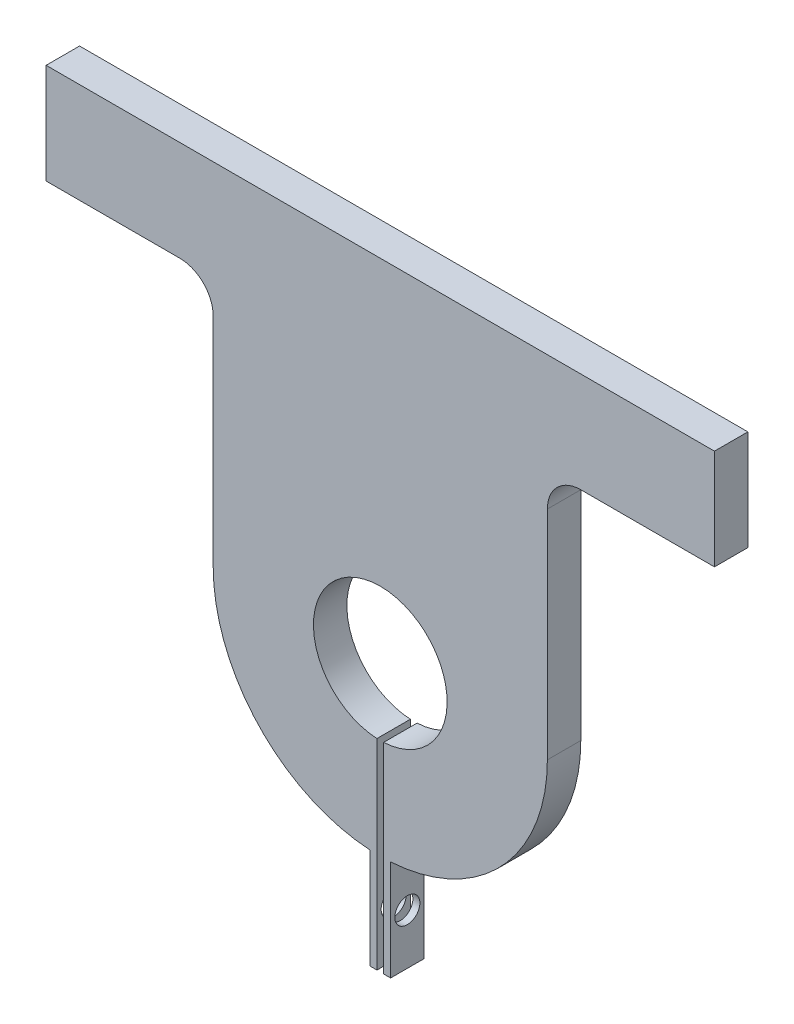
ISO-10303-21;
HEADER;
FILE_DESCRIPTION(('STEP AP214'),'2;1');
FILE_NAME('part.step','',(''),(''),'','','');
FILE_SCHEMA(('AUTOMOTIVE_DESIGN { 1 0 10303 214 1 1 1 1 }'));
ENDSEC;
DATA;
#1=APPLICATION_CONTEXT('core data for automotive mechanical design processes');
#2=APPLICATION_PROTOCOL_DEFINITION('international standard','automotive_design',2000,#1);
#3=PRODUCT_CONTEXT('',#1,'mechanical');
#4=PRODUCT('Part','Part','',(#3));
#5=PRODUCT_RELATED_PRODUCT_CATEGORY('part','',(#4));
#6=PRODUCT_DEFINITION_FORMATION('','',#4);
#7=PRODUCT_DEFINITION_CONTEXT('part definition',#1,'design');
#8=PRODUCT_DEFINITION('design','',#6,#7);
#9=PRODUCT_DEFINITION_SHAPE('','',#8);
#10=(LENGTH_UNIT() NAMED_UNIT(*) SI_UNIT(.MILLI.,.METRE.));
#11=(NAMED_UNIT(*) PLANE_ANGLE_UNIT() SI_UNIT($,.RADIAN.));
#12=(NAMED_UNIT(*) SI_UNIT($,.STERADIAN.) SOLID_ANGLE_UNIT());
#13=UNCERTAINTY_MEASURE_WITH_UNIT(LENGTH_MEASURE(1.E-05),#10,'distance_accuracy_value','');
#14=(GEOMETRIC_REPRESENTATION_CONTEXT(3) GLOBAL_UNCERTAINTY_ASSIGNED_CONTEXT((#13)) GLOBAL_UNIT_ASSIGNED_CONTEXT((#10,
#11,#12)) REPRESENTATION_CONTEXT('',''));
#15=CARTESIAN_POINT('',(0.,0.,0.));
#16=DIRECTION('',(0.,0.,1.));
#17=DIRECTION('',(1.,0.,0.));
#18=AXIS2_PLACEMENT_3D('',#15,#16,#17);
#19=CARTESIAN_POINT('',(0.507999999999998,-40.6349194918984,5.08));
#20=DIRECTION('',(0.,1.,0.));
#21=DIRECTION('',(0.,0.,1.));
#22=AXIS2_PLACEMENT_3D('',#19,#20,#21);
#23=PLANE('',#22);
#24=DIRECTION('',(1.,0.,0.));
#25=VECTOR('',#24,1.);
#26=CARTESIAN_POINT('',(0.507999999999998,-40.6349194918984,0.));
#27=LINE('',#26,#25);
#28=CARTESIAN_POINT('',(0.507999999999998,-40.6349194918984,0.));
#29=VERTEX_POINT('',#28);
#30=CARTESIAN_POINT('',(1.57406012625575,-40.6349194918984,0.));
#31=VERTEX_POINT('',#30);
#32=EDGE_CURVE('E210',#29,#31,#27,.T.);
#33=ORIENTED_EDGE('',*,*,#32,.T.);
#34=DIRECTION('',(0.,0.,-1.));
#35=VECTOR('',#34,1.);
#36=CARTESIAN_POINT('',(1.57406012625575,-40.6349194918984,5.08));
#37=LINE('',#36,#35);
#38=CARTESIAN_POINT('',(1.57406012625575,-40.6349194918984,5.08));
#39=VERTEX_POINT('',#38);
#40=EDGE_CURVE('E11',#39,#31,#37,.T.);
#41=ORIENTED_EDGE('',*,*,#40,.F.);
#42=DIRECTION('',(1.,0.,0.));
#43=VECTOR('',#42,1.);
#44=CARTESIAN_POINT('',(0.507999999999998,-40.6349194918984,5.08));
#45=LINE('',#44,#43);
#46=CARTESIAN_POINT('',(0.507999999999998,-40.6349194918984,5.08));
#47=VERTEX_POINT('',#46);
#48=EDGE_CURVE('E265',#47,#39,#45,.T.);
#49=ORIENTED_EDGE('',*,*,#48,.F.);
#50=DIRECTION('',(0.,0.,-1.));
#51=VECTOR('',#50,1.);
#52=CARTESIAN_POINT('',(0.507999999999998,-40.6349194918984,5.08));
#53=LINE('',#52,#51);
#54=EDGE_CURVE('E206',#47,#29,#53,.T.);
#55=ORIENTED_EDGE('',*,*,#54,.T.);
#56=EDGE_LOOP('',(#33,#41,#49,#55));
#57=FACE_BOUND('',#56,.T.);
#58=ADVANCED_FACE('F47',(#57),#23,.F.);
#59=CARTESIAN_POINT('',(1.57406012625575,-40.6349194918984,5.08));
#60=DIRECTION('',(-1.,0.,0.));
#61=DIRECTION('',(0.,-1.,0.));
#62=AXIS2_PLACEMENT_3D('',#59,#60,#61);
#63=PLANE('',#62);
#64=CARTESIAN_POINT('',(1.57406012625568,-32.9711801445008,2.54));
#65=DIRECTION('',(1.,0.,0.));
#66=DIRECTION('',(0.,1.,0.));
#67=AXIS2_PLACEMENT_3D('',#64,#65,#66);
#68=CIRCLE('',#67,1.905);
#69=CARTESIAN_POINT('',(1.57406012625568,-31.0661801445008,2.54));
#70=VERTEX_POINT('',#69);
#71=EDGE_CURVE('E465',#70,#70,#68,.T.);
#72=ORIENTED_EDGE('',*,*,#71,.F.);
#73=EDGE_LOOP('',(#72));
#74=FACE_BOUND('',#73,.T.);
#75=DIRECTION('',(0.,1.,0.));
#76=VECTOR('',#75,1.);
#77=CARTESIAN_POINT('',(1.57406012625575,-40.6349194918984,0.));
#78=LINE('',#77,#76);
#79=CARTESIAN_POINT('',(1.57406012625575,-25.3511801445008,0.));
#80=VERTEX_POINT('',#79);
#81=EDGE_CURVE('E214',#31,#80,#78,.T.);
#82=ORIENTED_EDGE('',*,*,#81,.T.);
#83=DIRECTION('',(0.,0.,-1.));
#84=VECTOR('',#83,1.);
#85=CARTESIAN_POINT('',(1.57406012625575,-25.3511801445008,5.08));
#86=LINE('',#85,#84);
#87=CARTESIAN_POINT('',(1.57406012625575,-25.3511801445008,5.08));
#88=VERTEX_POINT('',#87);
#89=EDGE_CURVE('E57',#88,#80,#86,.T.);
#90=ORIENTED_EDGE('',*,*,#89,.F.);
#91=DIRECTION('',(0.,1.,0.));
#92=VECTOR('',#91,1.);
#93=CARTESIAN_POINT('',(1.57406012625575,-40.6349194918984,5.08));
#94=LINE('',#93,#92);
#95=EDGE_CURVE('E136',#39,#88,#94,.T.);
#96=ORIENTED_EDGE('',*,*,#95,.F.);
#97=ORIENTED_EDGE('',*,*,#40,.T.);
#98=EDGE_LOOP('',(#82,#90,#96,#97));
#99=FACE_BOUND('',#98,.T.);
#100=ADVANCED_FACE('F475',(#74,#99),#63,.F.);
#101=CARTESIAN_POINT('',(0.,0.,5.08));
#102=DIRECTION('',(0.,0.,-1.));
#103=DIRECTION('',(-1.,0.,0.));
#104=AXIS2_PLACEMENT_3D('',#101,#102,#103);
#105=CYLINDRICAL_SURFACE('',#104,25.4);
#106=CARTESIAN_POINT('',(0.,0.,0.));
#107=DIRECTION('',(0.,0.,1.));
#108=DIRECTION('',(1.,0.,0.));
#109=AXIS2_PLACEMENT_3D('',#106,#107,#108);
#110=CIRCLE('',#109,25.4);
#111=CARTESIAN_POINT('',(25.4,0.,0.));
#112=VERTEX_POINT('',#111);
#113=EDGE_CURVE('E218',#80,#112,#110,.T.);
#114=ORIENTED_EDGE('',*,*,#113,.T.);
#115=DIRECTION('',(0.,0.,-1.));
#116=VECTOR('',#115,1.);
#117=CARTESIAN_POINT('',(25.4,0.,5.08));
#118=LINE('',#117,#116);
#119=CARTESIAN_POINT('',(25.4,0.,5.08));
#120=VERTEX_POINT('',#119);
#121=EDGE_CURVE('E316',#120,#112,#118,.T.);
#122=ORIENTED_EDGE('',*,*,#121,.F.);
#123=CARTESIAN_POINT('',(0.,0.,5.08));
#124=DIRECTION('',(0.,0.,1.));
#125=DIRECTION('',(1.,0.,0.));
#126=AXIS2_PLACEMENT_3D('',#123,#124,#125);
#127=CIRCLE('',#126,25.4);
#128=EDGE_CURVE('E328',#88,#120,#127,.T.);
#129=ORIENTED_EDGE('',*,*,#128,.F.);
#130=ORIENTED_EDGE('',*,*,#89,.T.);
#131=EDGE_LOOP('',(#114,#122,#129,#130));
#132=FACE_BOUND('',#131,.T.);
#133=ADVANCED_FACE('F326',(#132),#105,.T.);
#134=CARTESIAN_POINT('',(25.4,33.02,5.08));
#135=DIRECTION('',(-1.,0.,0.));
#136=DIRECTION('',(0.,-1.,0.));
#137=AXIS2_PLACEMENT_3D('',#134,#135,#136);
#138=PLANE('',#137);
#139=DIRECTION('',(0.,1.,0.));
#140=VECTOR('',#139,1.);
#141=CARTESIAN_POINT('',(25.4,33.02,0.));
#142=LINE('',#141,#140);
#143=CARTESIAN_POINT('',(25.4,33.02,0.));
#144=VERTEX_POINT('',#143);
#145=EDGE_CURVE('E221',#112,#144,#142,.T.);
#146=ORIENTED_EDGE('',*,*,#145,.T.);
#147=DIRECTION('',(0.,0.,-1.));
#148=VECTOR('',#147,1.);
#149=CARTESIAN_POINT('',(25.4,33.02,5.08));
#150=LINE('',#149,#148);
#151=CARTESIAN_POINT('',(25.4,33.02,5.08));
#152=VERTEX_POINT('',#151);
#153=EDGE_CURVE('E312',#152,#144,#150,.T.);
#154=ORIENTED_EDGE('',*,*,#153,.F.);
#155=DIRECTION('',(0.,1.,0.));
#156=VECTOR('',#155,1.);
#157=CARTESIAN_POINT('',(25.4,33.02,5.08));
#158=LINE('',#157,#156);
#159=EDGE_CURVE('E345',#120,#152,#158,.T.);
#160=ORIENTED_EDGE('',*,*,#159,.F.);
#161=ORIENTED_EDGE('',*,*,#121,.T.);
#162=EDGE_LOOP('',(#146,#154,#160,#161));
#163=FACE_BOUND('',#162,.T.);
#164=ADVANCED_FACE('F335',(#163),#138,.F.);
#165=CARTESIAN_POINT('',(30.48,33.02,5.08));
#166=DIRECTION('',(0.,0.,-1.));
#167=DIRECTION('',(-1.,0.,0.));
#168=AXIS2_PLACEMENT_3D('',#165,#166,#167);
#169=CYLINDRICAL_SURFACE('',#168,5.08);
#170=CARTESIAN_POINT('',(30.48,33.02,0.));
#171=DIRECTION('',(0.,0.,-1.));
#172=DIRECTION('',(-1.,0.,0.));
#173=AXIS2_PLACEMENT_3D('',#170,#171,#172);
#174=CIRCLE('',#173,5.08);
#175=CARTESIAN_POINT('',(30.48,38.1,0.));
#176=VERTEX_POINT('',#175);
#177=EDGE_CURVE('E224',#144,#176,#174,.T.);
#178=ORIENTED_EDGE('',*,*,#177,.T.);
#179=DIRECTION('',(0.,0.,-1.));
#180=VECTOR('',#179,1.);
#181=CARTESIAN_POINT('',(30.48,38.1,5.08));
#182=LINE('',#181,#180);
#183=CARTESIAN_POINT('',(30.48,38.1,5.08));
#184=VERTEX_POINT('',#183);
#185=EDGE_CURVE('E308',#184,#176,#182,.T.);
#186=ORIENTED_EDGE('',*,*,#185,.F.);
#187=CARTESIAN_POINT('',(30.48,33.02,5.08));
#188=DIRECTION('',(0.,0.,-1.));
#189=DIRECTION('',(-1.,0.,0.));
#190=AXIS2_PLACEMENT_3D('',#187,#188,#189);
#191=CIRCLE('',#190,5.08);
#192=EDGE_CURVE('E341',#152,#184,#191,.T.);
#193=ORIENTED_EDGE('',*,*,#192,.F.);
#194=ORIENTED_EDGE('',*,*,#153,.T.);
#195=EDGE_LOOP('',(#178,#186,#193,#194));
#196=FACE_BOUND('',#195,.T.);
#197=ADVANCED_FACE('F339',(#196),#169,.F.);
#198=CARTESIAN_POINT('',(50.8,38.1,5.08));
#199=DIRECTION('',(0.,1.,0.));
#200=DIRECTION('',(-1.,0.,0.));
#201=AXIS2_PLACEMENT_3D('',#198,#199,#200);
#202=PLANE('',#201);
#203=DIRECTION('',(1.,0.,0.));
#204=VECTOR('',#203,1.);
#205=CARTESIAN_POINT('',(50.8,38.1,0.));
#206=LINE('',#205,#204);
#207=CARTESIAN_POINT('',(50.8,38.1,0.));
#208=VERTEX_POINT('',#207);
#209=EDGE_CURVE('E227',#176,#208,#206,.T.);
#210=ORIENTED_EDGE('',*,*,#209,.T.);
#211=DIRECTION('',(0.,0.,-1.));
#212=VECTOR('',#211,1.);
#213=CARTESIAN_POINT('',(50.8,38.1,5.08));
#214=LINE('',#213,#212);
#215=CARTESIAN_POINT('',(50.8,38.1,5.08));
#216=VERTEX_POINT('',#215);
#217=EDGE_CURVE('E304',#216,#208,#214,.T.);
#218=ORIENTED_EDGE('',*,*,#217,.F.);
#219=DIRECTION('',(1.,0.,0.));
#220=VECTOR('',#219,1.);
#221=CARTESIAN_POINT('',(50.8,38.1,5.08));
#222=LINE('',#221,#220);
#223=EDGE_CURVE('E344',#184,#216,#222,.T.);
#224=ORIENTED_EDGE('',*,*,#223,.F.);
#225=ORIENTED_EDGE('',*,*,#185,.T.);
#226=EDGE_LOOP('',(#210,#218,#224,#225));
#227=FACE_BOUND('',#226,.T.);
#228=ADVANCED_FACE('F518',(#227),#202,.F.);
#229=CARTESIAN_POINT('',(50.8,53.34,5.08));
#230=DIRECTION('',(-1.,0.,0.));
#231=DIRECTION('',(0.,0.,1.));
#232=AXIS2_PLACEMENT_3D('',#229,#230,#231);
#233=PLANE('',#232);
#234=DIRECTION('',(0.,1.,0.));
#235=VECTOR('',#234,1.);
#236=CARTESIAN_POINT('',(50.8,53.34,0.));
#237=LINE('',#236,#235);
#238=CARTESIAN_POINT('',(50.8,53.34,0.));
#239=VERTEX_POINT('',#238);
#240=EDGE_CURVE('E230',#208,#239,#237,.T.);
#241=ORIENTED_EDGE('',*,*,#240,.T.);
#242=DIRECTION('',(0.,0.,-1.));
#243=VECTOR('',#242,1.);
#244=CARTESIAN_POINT('',(50.8,53.34,5.08));
#245=LINE('',#244,#243);
#246=CARTESIAN_POINT('',(50.8,53.34,5.08));
#247=VERTEX_POINT('',#246);
#248=EDGE_CURVE('E300',#247,#239,#245,.T.);
#249=ORIENTED_EDGE('',*,*,#248,.F.);
#250=DIRECTION('',(0.,1.,0.));
#251=VECTOR('',#250,1.);
#252=CARTESIAN_POINT('',(50.8,53.34,5.08));
#253=LINE('',#252,#251);
#254=EDGE_CURVE('E350',#216,#247,#253,.T.);
#255=ORIENTED_EDGE('',*,*,#254,.F.);
#256=ORIENTED_EDGE('',*,*,#217,.T.);
#257=EDGE_LOOP('',(#241,#249,#255,#256));
#258=FACE_BOUND('',#257,.T.);
#259=ADVANCED_FACE('F526',(#258),#233,.F.);
#260=CARTESIAN_POINT('',(-50.8,53.34,5.08));
#261=DIRECTION('',(0.,-1.,0.));
#262=DIRECTION('',(1.,0.,0.));
#263=AXIS2_PLACEMENT_3D('',#260,#261,#262);
#264=PLANE('',#263);
#265=DIRECTION('',(-1.,0.,0.));
#266=VECTOR('',#265,1.);
#267=CARTESIAN_POINT('',(-50.8,53.34,0.));
#268=LINE('',#267,#266);
#269=CARTESIAN_POINT('',(-50.8,53.34,0.));
#270=VERTEX_POINT('',#269);
#271=EDGE_CURVE('E233',#239,#270,#268,.T.);
#272=ORIENTED_EDGE('',*,*,#271,.T.);
#273=DIRECTION('',(0.,0.,-1.));
#274=VECTOR('',#273,1.);
#275=CARTESIAN_POINT('',(-50.8,53.34,5.08));
#276=LINE('',#275,#274);
#277=CARTESIAN_POINT('',(-50.8,53.34,5.08));
#278=VERTEX_POINT('',#277);
#279=EDGE_CURVE('E296',#278,#270,#276,.T.);
#280=ORIENTED_EDGE('',*,*,#279,.F.);
#281=DIRECTION('',(-1.,0.,0.));
#282=VECTOR('',#281,1.);
#283=CARTESIAN_POINT('',(-50.8,53.34,5.08));
#284=LINE('',#283,#282);
#285=EDGE_CURVE('E357',#247,#278,#284,.T.);
#286=ORIENTED_EDGE('',*,*,#285,.F.);
#287=ORIENTED_EDGE('',*,*,#248,.T.);
#288=EDGE_LOOP('',(#272,#280,#286,#287));
#289=FACE_BOUND('',#288,.T.);
#290=ADVANCED_FACE('F535',(#289),#264,.F.);
#291=CARTESIAN_POINT('',(-50.8,38.1,5.08));
#292=DIRECTION('',(1.,0.,0.));
#293=DIRECTION('',(0.,0.,-1.));
#294=AXIS2_PLACEMENT_3D('',#291,#292,#293);
#295=PLANE('',#294);
#296=DIRECTION('',(0.,-1.,0.));
#297=VECTOR('',#296,1.);
#298=CARTESIAN_POINT('',(-50.8,38.1,0.));
#299=LINE('',#298,#297);
#300=CARTESIAN_POINT('',(-50.8,38.1,0.));
#301=VERTEX_POINT('',#300);
#302=EDGE_CURVE('E236',#270,#301,#299,.T.);
#303=ORIENTED_EDGE('',*,*,#302,.T.);
#304=DIRECTION('',(0.,0.,-1.));
#305=VECTOR('',#304,1.);
#306=CARTESIAN_POINT('',(-50.8,38.1,5.08));
#307=LINE('',#306,#305);
#308=CARTESIAN_POINT('',(-50.8,38.1,5.08));
#309=VERTEX_POINT('',#308);
#310=EDGE_CURVE('E292',#309,#301,#307,.T.);
#311=ORIENTED_EDGE('',*,*,#310,.F.);
#312=DIRECTION('',(0.,-1.,0.));
#313=VECTOR('',#312,1.);
#314=CARTESIAN_POINT('',(-50.8,38.1,5.08));
#315=LINE('',#314,#313);
#316=EDGE_CURVE('E360',#278,#309,#315,.T.);
#317=ORIENTED_EDGE('',*,*,#316,.F.);
#318=ORIENTED_EDGE('',*,*,#279,.T.);
#319=EDGE_LOOP('',(#303,#311,#317,#318));
#320=FACE_BOUND('',#319,.T.);
#321=ADVANCED_FACE('F544',(#320),#295,.F.);
#322=CARTESIAN_POINT('',(-30.48,38.1,5.08));
#323=DIRECTION('',(0.,1.,0.));
#324=DIRECTION('',(0.,0.,1.));
#325=AXIS2_PLACEMENT_3D('',#322,#323,#324);
#326=PLANE('',#325);
#327=DIRECTION('',(1.,0.,0.));
#328=VECTOR('',#327,1.);
#329=CARTESIAN_POINT('',(-30.48,38.1,0.));
#330=LINE('',#329,#328);
#331=CARTESIAN_POINT('',(-30.48,38.1,0.));
#332=VERTEX_POINT('',#331);
#333=EDGE_CURVE('E239',#301,#332,#330,.T.);
#334=ORIENTED_EDGE('',*,*,#333,.T.);
#335=DIRECTION('',(0.,0.,-1.));
#336=VECTOR('',#335,1.);
#337=CARTESIAN_POINT('',(-30.48,38.1,5.08));
#338=LINE('',#337,#336);
#339=CARTESIAN_POINT('',(-30.48,38.1,5.08));
#340=VERTEX_POINT('',#339);
#341=EDGE_CURVE('E288',#340,#332,#338,.T.);
#342=ORIENTED_EDGE('',*,*,#341,.F.);
#343=DIRECTION('',(1.,0.,0.));
#344=VECTOR('',#343,1.);
#345=CARTESIAN_POINT('',(-30.48,38.1,5.08));
#346=LINE('',#345,#344);
#347=EDGE_CURVE('E363',#309,#340,#346,.T.);
#348=ORIENTED_EDGE('',*,*,#347,.F.);
#349=ORIENTED_EDGE('',*,*,#310,.T.);
#350=EDGE_LOOP('',(#334,#342,#348,#349));
#351=FACE_BOUND('',#350,.T.);
#352=ADVANCED_FACE('F553',(#351),#326,.F.);
#353=CARTESIAN_POINT('',(-30.48,33.02,5.08));
#354=DIRECTION('',(0.,0.,-1.));
#355=DIRECTION('',(-1.,0.,0.));
#356=AXIS2_PLACEMENT_3D('',#353,#354,#355);
#357=CYLINDRICAL_SURFACE('',#356,5.08);
#358=CARTESIAN_POINT('',(-30.48,33.02,0.));
#359=DIRECTION('',(0.,0.,-1.));
#360=DIRECTION('',(1.,0.,0.));
#361=AXIS2_PLACEMENT_3D('',#358,#359,#360);
#362=CIRCLE('',#361,5.08);
#363=CARTESIAN_POINT('',(-25.4,33.02,0.));
#364=VERTEX_POINT('',#363);
#365=EDGE_CURVE('E242',#332,#364,#362,.T.);
#366=ORIENTED_EDGE('',*,*,#365,.T.);
#367=DIRECTION('',(0.,0.,-1.));
#368=VECTOR('',#367,1.);
#369=CARTESIAN_POINT('',(-25.4,33.02,5.08));
#370=LINE('',#369,#368);
#371=CARTESIAN_POINT('',(-25.4,33.02,5.08));
#372=VERTEX_POINT('',#371);
#373=EDGE_CURVE('E284',#372,#364,#370,.T.);
#374=ORIENTED_EDGE('',*,*,#373,.F.);
#375=CARTESIAN_POINT('',(-30.48,33.02,5.08));
#376=DIRECTION('',(0.,0.,-1.));
#377=DIRECTION('',(1.,0.,0.));
#378=AXIS2_PLACEMENT_3D('',#375,#376,#377);
#379=CIRCLE('',#378,5.08);
#380=EDGE_CURVE('E366',#340,#372,#379,.T.);
#381=ORIENTED_EDGE('',*,*,#380,.F.);
#382=ORIENTED_EDGE('',*,*,#341,.T.);
#383=EDGE_LOOP('',(#366,#374,#381,#382));
#384=FACE_BOUND('',#383,.T.);
#385=ADVANCED_FACE('F562',(#384),#357,.F.);
#386=CARTESIAN_POINT('',(-25.4,0.,5.08));
#387=DIRECTION('',(1.,0.,0.));
#388=DIRECTION('',(0.,1.,0.));
#389=AXIS2_PLACEMENT_3D('',#386,#387,#388);
#390=PLANE('',#389);
#391=DIRECTION('',(0.,-1.,0.));
#392=VECTOR('',#391,1.);
#393=CARTESIAN_POINT('',(-25.4,0.,0.));
#394=LINE('',#393,#392);
#395=CARTESIAN_POINT('',(-25.4,0.,0.));
#396=VERTEX_POINT('',#395);
#397=EDGE_CURVE('E245',#364,#396,#394,.T.);
#398=ORIENTED_EDGE('',*,*,#397,.T.);
#399=DIRECTION('',(0.,0.,-1.));
#400=VECTOR('',#399,1.);
#401=CARTESIAN_POINT('',(-25.4,0.,5.08));
#402=LINE('',#401,#400);
#403=CARTESIAN_POINT('',(-25.4,0.,5.08));
#404=VERTEX_POINT('',#403);
#405=EDGE_CURVE('E280',#404,#396,#402,.T.);
#406=ORIENTED_EDGE('',*,*,#405,.F.);
#407=DIRECTION('',(0.,-1.,0.));
#408=VECTOR('',#407,1.);
#409=CARTESIAN_POINT('',(-25.4,0.,5.08));
#410=LINE('',#409,#408);
#411=EDGE_CURVE('E369',#372,#404,#410,.T.);
#412=ORIENTED_EDGE('',*,*,#411,.F.);
#413=ORIENTED_EDGE('',*,*,#373,.T.);
#414=EDGE_LOOP('',(#398,#406,#412,#413));
#415=FACE_BOUND('',#414,.T.);
#416=ADVANCED_FACE('F571',(#415),#390,.F.);
#417=CARTESIAN_POINT('',(0.,0.,5.08));
#418=DIRECTION('',(0.,0.,-1.));
#419=DIRECTION('',(-1.,0.,0.));
#420=AXIS2_PLACEMENT_3D('',#417,#418,#419);
#421=CYLINDRICAL_SURFACE('',#420,25.4);
#422=CARTESIAN_POINT('',(0.,0.,0.));
#423=DIRECTION('',(0.,0.,1.));
#424=DIRECTION('',(1.,0.,0.));
#425=AXIS2_PLACEMENT_3D('',#422,#423,#424);
#426=CIRCLE('',#425,25.4);
#427=CARTESIAN_POINT('',(-1.57406012625574,-25.3511801445008,0.));
#428=VERTEX_POINT('',#427);
#429=EDGE_CURVE('E248',#396,#428,#426,.T.);
#430=ORIENTED_EDGE('',*,*,#429,.T.);
#431=DIRECTION('',(0.,0.,-1.));
#432=VECTOR('',#431,1.);
#433=CARTESIAN_POINT('',(-1.57406012625574,-25.3511801445008,5.08));
#434=LINE('',#433,#432);
#435=CARTESIAN_POINT('',(-1.57406012625574,-25.3511801445008,5.08));
#436=VERTEX_POINT('',#435);
#437=EDGE_CURVE('E276',#436,#428,#434,.T.);
#438=ORIENTED_EDGE('',*,*,#437,.F.);
#439=CARTESIAN_POINT('',(0.,0.,5.08));
#440=DIRECTION('',(0.,0.,1.));
#441=DIRECTION('',(1.,0.,0.));
#442=AXIS2_PLACEMENT_3D('',#439,#440,#441);
#443=CIRCLE('',#442,25.4);
#444=EDGE_CURVE('E372',#404,#436,#443,.T.);
#445=ORIENTED_EDGE('',*,*,#444,.F.);
#446=ORIENTED_EDGE('',*,*,#405,.T.);
#447=EDGE_LOOP('',(#430,#438,#445,#446));
#448=FACE_BOUND('',#447,.T.);
#449=ADVANCED_FACE('F580',(#448),#421,.T.);
#450=CARTESIAN_POINT('',(-1.57406012625574,-40.6349194918984,5.08));
#451=DIRECTION('',(1.,0.,0.));
#452=DIRECTION('',(0.,0.,-1.));
#453=AXIS2_PLACEMENT_3D('',#450,#451,#452);
#454=PLANE('',#453);
#455=CARTESIAN_POINT('',(-1.57406012625574,-32.9711801445008,2.54));
#456=DIRECTION('',(1.,0.,0.));
#457=DIRECTION('',(0.,0.,-1.));
#458=AXIS2_PLACEMENT_3D('',#455,#456,#457);
#459=CIRCLE('',#458,1.905);
#460=CARTESIAN_POINT('',(-1.57406012625574,-32.9711801445008,0.634999999999999));
#461=VERTEX_POINT('',#460);
#462=EDGE_CURVE('E215',#461,#461,#459,.T.);
#463=ORIENTED_EDGE('',*,*,#462,.T.);
#464=EDGE_LOOP('',(#463));
#465=FACE_BOUND('',#464,.T.);
#466=DIRECTION('',(0.,-1.,0.));
#467=VECTOR('',#466,1.);
#468=CARTESIAN_POINT('',(-1.57406012625574,-40.6349194918984,0.));
#469=LINE('',#468,#467);
#470=CARTESIAN_POINT('',(-1.57406012625574,-40.6349194918984,0.));
#471=VERTEX_POINT('',#470);
#472=EDGE_CURVE('E251',#428,#471,#469,.T.);
#473=ORIENTED_EDGE('',*,*,#472,.T.);
#474=DIRECTION('',(0.,0.,-1.));
#475=VECTOR('',#474,1.);
#476=CARTESIAN_POINT('',(-1.57406012625574,-40.6349194918984,5.08));
#477=LINE('',#476,#475);
#478=CARTESIAN_POINT('',(-1.57406012625574,-40.6349194918984,5.08));
#479=VERTEX_POINT('',#478);
#480=EDGE_CURVE('E272',#479,#471,#477,.T.);
#481=ORIENTED_EDGE('',*,*,#480,.F.);
#482=DIRECTION('',(0.,-1.,0.));
#483=VECTOR('',#482,1.);
#484=CARTESIAN_POINT('',(-1.57406012625574,-40.6349194918984,5.08));
#485=LINE('',#484,#483);
#486=EDGE_CURVE('E375',#436,#479,#485,.T.);
#487=ORIENTED_EDGE('',*,*,#486,.F.);
#488=ORIENTED_EDGE('',*,*,#437,.T.);
#489=EDGE_LOOP('',(#473,#481,#487,#488));
#490=FACE_BOUND('',#489,.T.);
#491=ADVANCED_FACE('F589',(#465,#490),#454,.F.);
#492=CARTESIAN_POINT('',(-0.507999999999986,-40.6349194918984,5.08));
#493=DIRECTION('',(0.,1.,0.));
#494=DIRECTION('',(0.,0.,1.));
#495=AXIS2_PLACEMENT_3D('',#492,#493,#494);
#496=PLANE('',#495);
#497=DIRECTION('',(1.,0.,0.));
#498=VECTOR('',#497,1.);
#499=CARTESIAN_POINT('',(-0.507999999999986,-40.6349194918984,0.));
#500=LINE('',#499,#498);
#501=CARTESIAN_POINT('',(-0.507999999999986,-40.6349194918984,0.));
#502=VERTEX_POINT('',#501);
#503=EDGE_CURVE('E254',#471,#502,#500,.T.);
#504=ORIENTED_EDGE('',*,*,#503,.T.);
#505=DIRECTION('',(0.,0.,-1.));
#506=VECTOR('',#505,1.);
#507=CARTESIAN_POINT('',(-0.507999999999986,-40.6349194918984,5.08));
#508=LINE('',#507,#506);
#509=CARTESIAN_POINT('',(-0.507999999999986,-40.6349194918984,5.08));
#510=VERTEX_POINT('',#509);
#511=EDGE_CURVE('E198',#510,#502,#508,.T.);
#512=ORIENTED_EDGE('',*,*,#511,.F.);
#513=DIRECTION('',(1.,0.,0.));
#514=VECTOR('',#513,1.);
#515=CARTESIAN_POINT('',(-0.507999999999986,-40.6349194918984,5.08));
#516=LINE('',#515,#514);
#517=EDGE_CURVE('E186',#479,#510,#516,.T.);
#518=ORIENTED_EDGE('',*,*,#517,.F.);
#519=ORIENTED_EDGE('',*,*,#480,.T.);
#520=EDGE_LOOP('',(#504,#512,#518,#519));
#521=FACE_BOUND('',#520,.T.);
#522=ADVANCED_FACE('F596',(#521),#496,.F.);
#523=CARTESIAN_POINT('',(-0.508,-10.1472920525626,5.08));
#524=DIRECTION('',(-1.,0.,0.));
#525=DIRECTION('',(0.,-1.,0.));
#526=AXIS2_PLACEMENT_3D('',#523,#524,#525);
#527=PLANE('',#526);
#528=CARTESIAN_POINT('',(-0.507999999999981,-32.9711801445008,2.54));
#529=DIRECTION('',(-1.,0.,0.));
#530=DIRECTION('',(0.,-1.,0.));
#531=AXIS2_PLACEMENT_3D('',#528,#529,#530);
#532=CIRCLE('',#531,1.905);
#533=CARTESIAN_POINT('',(-0.507999999999979,-34.8761801445008,2.54));
#534=VERTEX_POINT('',#533);
#535=EDGE_CURVE('E454',#534,#534,#532,.T.);
#536=ORIENTED_EDGE('',*,*,#535,.T.);
#537=EDGE_LOOP('',(#536));
#538=FACE_BOUND('',#537,.T.);
#539=DIRECTION('',(0.,1.,0.));
#540=VECTOR('',#539,1.);
#541=CARTESIAN_POINT('',(-0.508,-10.1472920525626,0.));
#542=LINE('',#541,#540);
#543=CARTESIAN_POINT('',(-0.508000000000014,-10.1472920525626,0.));
#544=VERTEX_POINT('',#543);
#545=EDGE_CURVE('E195',#502,#544,#542,.T.);
#546=ORIENTED_EDGE('',*,*,#545,.T.);
#547=DIRECTION('',(0.,0.,-1.));
#548=VECTOR('',#547,1.);
#549=CARTESIAN_POINT('',(-0.508000000000014,-10.1472920525626,5.08));
#550=LINE('',#549,#548);
#551=CARTESIAN_POINT('',(-0.508000000000014,-10.1472920525626,5.08));
#552=VERTEX_POINT('',#551);
#553=EDGE_CURVE('E193',#552,#544,#550,.T.);
#554=ORIENTED_EDGE('',*,*,#553,.F.);
#555=DIRECTION('',(0.,1.,0.));
#556=VECTOR('',#555,1.);
#557=CARTESIAN_POINT('',(-0.507999999999987,-25.3949194918984,5.08));
#558=LINE('',#557,#556);
#559=EDGE_CURVE('E179',#510,#552,#558,.T.);
#560=ORIENTED_EDGE('',*,*,#559,.F.);
#561=ORIENTED_EDGE('',*,*,#511,.T.);
#562=EDGE_LOOP('',(#546,#554,#560,#561));
#563=FACE_BOUND('',#562,.T.);
#564=ADVANCED_FACE('F194',(#538,#563),#527,.F.);
#565=CARTESIAN_POINT('',(0.,0.,5.08));
#566=DIRECTION('',(0.,0.,-1.));
#567=DIRECTION('',(-1.,0.,0.));
#568=AXIS2_PLACEMENT_3D('',#565,#566,#567);
#569=CYLINDRICAL_SURFACE('',#568,10.16);
#570=CARTESIAN_POINT('',(0.,0.,0.));
#571=DIRECTION('',(0.,0.,-1.));
#572=DIRECTION('',(1.,0.,0.));
#573=AXIS2_PLACEMENT_3D('',#570,#571,#572);
#574=CIRCLE('',#573,10.16);
#575=CARTESIAN_POINT('',(0.508,-10.1472920525626,0.));
#576=VERTEX_POINT('',#575);
#577=EDGE_CURVE('E260',#544,#576,#574,.T.);
#578=ORIENTED_EDGE('',*,*,#577,.T.);
#579=DIRECTION('',(0.,0.,-1.));
#580=VECTOR('',#579,1.);
#581=CARTESIAN_POINT('',(0.508,-10.1472920525626,5.08));
#582=LINE('',#581,#580);
#583=CARTESIAN_POINT('',(0.508,-10.1472920525626,5.08));
#584=VERTEX_POINT('',#583);
#585=EDGE_CURVE('E199',#584,#576,#582,.T.);
#586=ORIENTED_EDGE('',*,*,#585,.F.);
#587=CARTESIAN_POINT('',(0.,0.,5.08));
#588=DIRECTION('',(0.,0.,-1.));
#589=DIRECTION('',(1.,0.,0.));
#590=AXIS2_PLACEMENT_3D('',#587,#588,#589);
#591=CIRCLE('',#590,10.16);
#592=EDGE_CURVE('E183',#552,#584,#591,.T.);
#593=ORIENTED_EDGE('',*,*,#592,.F.);
#594=ORIENTED_EDGE('',*,*,#553,.T.);
#595=EDGE_LOOP('',(#578,#586,#593,#594));
#596=FACE_BOUND('',#595,.T.);
#597=ADVANCED_FACE('F201',(#596),#569,.F.);
#598=CARTESIAN_POINT('',(0.507999999999996,-25.3949194918984,5.08));
#599=DIRECTION('',(1.,0.,0.));
#600=DIRECTION('',(0.,1.,0.));
#601=AXIS2_PLACEMENT_3D('',#598,#599,#600);
#602=PLANE('',#601);
#603=CARTESIAN_POINT('',(0.507999999999995,-32.9711801445008,2.54));
#604=DIRECTION('',(1.,0.,0.));
#605=DIRECTION('',(0.,1.,0.));
#606=AXIS2_PLACEMENT_3D('',#603,#604,#605);
#607=CIRCLE('',#606,1.905);
#608=CARTESIAN_POINT('',(0.507999999999994,-31.0661801445008,2.54));
#609=VERTEX_POINT('',#608);
#610=EDGE_CURVE('E50',#609,#609,#607,.T.);
#611=ORIENTED_EDGE('',*,*,#610,.T.);
#612=EDGE_LOOP('',(#611));
#613=FACE_BOUND('',#612,.T.);
#614=DIRECTION('',(0.,-1.,0.));
#615=VECTOR('',#614,1.);
#616=CARTESIAN_POINT('',(0.507999999999996,-25.3949194918984,0.));
#617=LINE('',#616,#615);
#618=EDGE_CURVE('E124',#576,#29,#617,.T.);
#619=ORIENTED_EDGE('',*,*,#618,.T.);
#620=ORIENTED_EDGE('',*,*,#54,.F.);
#621=DIRECTION('',(0.,-1.,0.));
#622=VECTOR('',#621,1.);
#623=CARTESIAN_POINT('',(0.508,-10.1472920525626,5.08));
#624=LINE('',#623,#622);
#625=EDGE_CURVE('E65',#584,#47,#624,.T.);
#626=ORIENTED_EDGE('',*,*,#625,.F.);
#627=ORIENTED_EDGE('',*,*,#585,.T.);
#628=EDGE_LOOP('',(#619,#620,#626,#627));
#629=FACE_BOUND('',#628,.T.);
#630=ADVANCED_FACE('F480',(#613,#629),#602,.F.);
#631=CARTESIAN_POINT('',(0.,0.,5.08));
#632=DIRECTION('',(0.,0.,1.));
#633=DIRECTION('',(1.,0.,0.));
#634=AXIS2_PLACEMENT_3D('',#631,#632,#633);
#635=PLANE('',#634);
#636=ORIENTED_EDGE('',*,*,#48,.T.);
#637=ORIENTED_EDGE('',*,*,#95,.T.);
#638=ORIENTED_EDGE('',*,*,#128,.T.);
#639=ORIENTED_EDGE('',*,*,#159,.T.);
#640=ORIENTED_EDGE('',*,*,#192,.T.);
#641=ORIENTED_EDGE('',*,*,#223,.T.);
#642=ORIENTED_EDGE('',*,*,#254,.T.);
#643=ORIENTED_EDGE('',*,*,#285,.T.);
#644=ORIENTED_EDGE('',*,*,#316,.T.);
#645=ORIENTED_EDGE('',*,*,#347,.T.);
#646=ORIENTED_EDGE('',*,*,#380,.T.);
#647=ORIENTED_EDGE('',*,*,#411,.T.);
#648=ORIENTED_EDGE('',*,*,#444,.T.);
#649=ORIENTED_EDGE('',*,*,#486,.T.);
#650=ORIENTED_EDGE('',*,*,#517,.T.);
#651=ORIENTED_EDGE('',*,*,#559,.T.);
#652=ORIENTED_EDGE('',*,*,#592,.T.);
#653=ORIENTED_EDGE('',*,*,#625,.T.);
#654=EDGE_LOOP('',(#636,#637,#638,#639,#640,#641,#642,#643,#644,#645,#646,#647,#648,#649,#650,
#651,#652,#653));
#655=FACE_BOUND('',#654,.T.);
#656=ADVANCED_FACE('F181',(#655),#635,.T.);
#657=CARTESIAN_POINT('',(0.,0.,0.));
#658=DIRECTION('',(0.,0.,1.));
#659=DIRECTION('',(1.,0.,0.));
#660=AXIS2_PLACEMENT_3D('',#657,#658,#659);
#661=PLANE('',#660);
#662=ORIENTED_EDGE('',*,*,#32,.F.);
#663=ORIENTED_EDGE('',*,*,#618,.F.);
#664=ORIENTED_EDGE('',*,*,#577,.F.);
#665=ORIENTED_EDGE('',*,*,#545,.F.);
#666=ORIENTED_EDGE('',*,*,#503,.F.);
#667=ORIENTED_EDGE('',*,*,#472,.F.);
#668=ORIENTED_EDGE('',*,*,#429,.F.);
#669=ORIENTED_EDGE('',*,*,#397,.F.);
#670=ORIENTED_EDGE('',*,*,#365,.F.);
#671=ORIENTED_EDGE('',*,*,#333,.F.);
#672=ORIENTED_EDGE('',*,*,#302,.F.);
#673=ORIENTED_EDGE('',*,*,#271,.F.);
#674=ORIENTED_EDGE('',*,*,#240,.F.);
#675=ORIENTED_EDGE('',*,*,#209,.F.);
#676=ORIENTED_EDGE('',*,*,#177,.F.);
#677=ORIENTED_EDGE('',*,*,#145,.F.);
#678=ORIENTED_EDGE('',*,*,#113,.F.);
#679=ORIENTED_EDGE('',*,*,#81,.F.);
#680=EDGE_LOOP('',(#662,#663,#664,#665,#666,#667,#668,#669,#670,#671,#672,#673,#674,#675,#676,
#677,#678,#679));
#681=FACE_BOUND('',#680,.T.);
#682=ADVANCED_FACE('F330',(#681),#661,.F.);
#683=CARTESIAN_POINT('',(-50.8000000000002,-32.9711801445007,2.54));
#684=DIRECTION('',(1.,0.,0.));
#685=DIRECTION('',(0.,1.,0.));
#686=AXIS2_PLACEMENT_3D('',#683,#684,#685);
#687=CYLINDRICAL_SURFACE('',#686,1.905);
#688=ORIENTED_EDGE('',*,*,#71,.T.);
#689=EDGE_LOOP('',(#688));
#690=FACE_BOUND('',#689,.T.);
#691=ORIENTED_EDGE('',*,*,#610,.F.);
#692=EDGE_LOOP('',(#691));
#693=FACE_BOUND('',#692,.T.);
#694=ADVANCED_FACE('F472',(#690,#693),#687,.F.);
#695=ORIENTED_EDGE('',*,*,#535,.F.);
#696=EDGE_LOOP('',(#695));
#697=FACE_BOUND('',#696,.T.);
#698=ORIENTED_EDGE('',*,*,#462,.F.);
#699=EDGE_LOOP('',(#698));
#700=FACE_BOUND('',#699,.T.);
#701=ADVANCED_FACE('F661',(#697,#700),#687,.F.);
#702=CLOSED_SHELL('',(#58,#100,#133,#164,#197,#228,#259,#290,#321,#352,#385,#416,#449,#491,#522,
#564,#597,#630,#656,#682,#694,#701));
#703=MANIFOLD_SOLID_BREP('B2',#702);
#704=ADVANCED_BREP_SHAPE_REPRESENTATION('',(#18,#703),#14);
#705=SHAPE_DEFINITION_REPRESENTATION(#9,#704);
ENDSEC;
END-ISO-10303-21;
